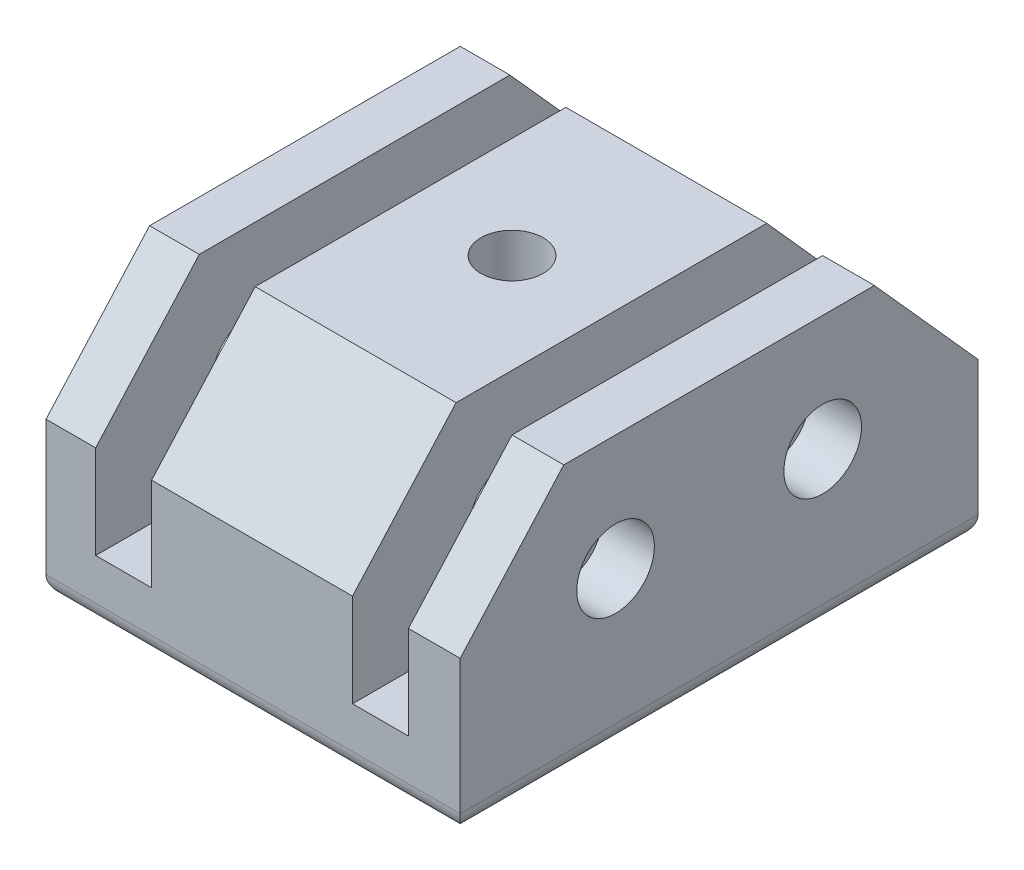
ISO-10303-21;
HEADER;
FILE_DESCRIPTION(('STEP AP214'),'2;1');
FILE_NAME('part.step','',(''),(''),'','','');
FILE_SCHEMA(('AUTOMOTIVE_DESIGN { 1 0 10303 214 1 1 1 1 }'));
ENDSEC;
DATA;
#1=APPLICATION_CONTEXT('core data for automotive mechanical design processes');
#2=APPLICATION_PROTOCOL_DEFINITION('international standard','automotive_design',2000,#1);
#3=PRODUCT_CONTEXT('',#1,'mechanical');
#4=PRODUCT('Part','Part','',(#3));
#5=PRODUCT_RELATED_PRODUCT_CATEGORY('part','',(#4));
#6=PRODUCT_DEFINITION_FORMATION('','',#4);
#7=PRODUCT_DEFINITION_CONTEXT('part definition',#1,'design');
#8=PRODUCT_DEFINITION('design','',#6,#7);
#9=PRODUCT_DEFINITION_SHAPE('','',#8);
#10=(LENGTH_UNIT() NAMED_UNIT(*) SI_UNIT(.MILLI.,.METRE.));
#11=(NAMED_UNIT(*) PLANE_ANGLE_UNIT() SI_UNIT($,.RADIAN.));
#12=(NAMED_UNIT(*) SI_UNIT($,.STERADIAN.) SOLID_ANGLE_UNIT());
#13=UNCERTAINTY_MEASURE_WITH_UNIT(LENGTH_MEASURE(1.E-05),#10,'distance_accuracy_value','');
#14=(GEOMETRIC_REPRESENTATION_CONTEXT(3) GLOBAL_UNCERTAINTY_ASSIGNED_CONTEXT((#13)) GLOBAL_UNIT_ASSIGNED_CONTEXT((#10,
#11,#12)) REPRESENTATION_CONTEXT('',''));
#15=CARTESIAN_POINT('',(0.,0.,0.));
#16=DIRECTION('',(0.,0.,1.));
#17=DIRECTION('',(1.,0.,0.));
#18=AXIS2_PLACEMENT_3D('',#15,#16,#17);
#19=CARTESIAN_POINT('',(-25.4,33.2490316571237,-31.75));
#20=DIRECTION('',(0.,-1.,0.));
#21=DIRECTION('',(0.,0.,-1.));
#22=AXIS2_PLACEMENT_3D('',#19,#20,#21);
#23=CYLINDRICAL_SURFACE('',#22,3.81);
#24=CARTESIAN_POINT('',(-25.4,33.2490316571237,-31.75));
#25=DIRECTION('',(0.,-1.,0.));
#26=DIRECTION('',(0.,0.,-1.));
#27=AXIS2_PLACEMENT_3D('',#24,#25,#26);
#28=CIRCLE('',#27,3.81);
#29=CARTESIAN_POINT('',(-25.4,33.2490316571237,-35.56));
#30=VERTEX_POINT('',#29);
#31=EDGE_CURVE('E293',#30,#30,#28,.T.);
#32=ORIENTED_EDGE('',*,*,#31,.F.);
#33=EDGE_LOOP('',(#32));
#34=FACE_BOUND('',#33,.T.);
#35=CARTESIAN_POINT('',(-25.4,6.35,-31.75));
#36=DIRECTION('',(0.,-1.,0.));
#37=DIRECTION('',(0.,0.,-1.));
#38=AXIS2_PLACEMENT_3D('',#35,#36,#37);
#39=CIRCLE('',#38,3.81);
#40=CARTESIAN_POINT('',(-25.4,6.35,-35.56));
#41=VERTEX_POINT('',#40);
#42=EDGE_CURVE('E49',#41,#41,#39,.F.);
#43=ORIENTED_EDGE('',*,*,#42,.F.);
#44=EDGE_LOOP('',(#43));
#45=FACE_BOUND('',#44,.T.);
#46=ADVANCED_FACE('F45',(#34,#45),#23,.F.);
#47=CARTESIAN_POINT('',(-50.8,19.05,0.));
#48=DIRECTION('',(0.,0.666666666666667,0.74535599249993));
#49=DIRECTION('',(0.,-0.74535599249993,0.666666666666667));
#50=AXIS2_PLACEMENT_3D('',#47,#48,#49);
#51=PLANE('',#50);
#52=DIRECTION('',(0.,-0.74535599249993,0.666666666666667));
#53=VECTOR('',#52,1.);
#54=CARTESIAN_POINT('',(-44.704,19.05,0.));
#55=LINE('',#54,#53);
#56=CARTESIAN_POINT('',(-44.704,33.2490316571237,-12.7));
#57=VERTEX_POINT('',#56);
#58=CARTESIAN_POINT('',(-44.704,19.05,0.));
#59=VERTEX_POINT('',#58);
#60=EDGE_CURVE('E383',#57,#59,#55,.T.);
#61=ORIENTED_EDGE('',*,*,#60,.F.);
#62=DIRECTION('',(1.,0.,0.));
#63=VECTOR('',#62,1.);
#64=CARTESIAN_POINT('',(-50.8,33.2490316571237,-12.7));
#65=LINE('',#64,#63);
#66=CARTESIAN_POINT('',(-50.8,33.2490316571237,-12.7));
#67=VERTEX_POINT('',#66);
#68=EDGE_CURVE('E462',#67,#57,#65,.T.);
#69=ORIENTED_EDGE('',*,*,#68,.F.);
#70=DIRECTION('',(0.,-0.74535599249993,0.666666666666667));
#71=VECTOR('',#70,1.);
#72=CARTESIAN_POINT('',(-50.8,19.05,0.));
#73=LINE('',#72,#71);
#74=CARTESIAN_POINT('',(-50.8,19.05,0.));
#75=VERTEX_POINT('',#74);
#76=EDGE_CURVE('E440',#67,#75,#73,.T.);
#77=ORIENTED_EDGE('',*,*,#76,.T.);
#78=DIRECTION('',(1.,0.,0.));
#79=VECTOR('',#78,1.);
#80=CARTESIAN_POINT('',(-50.8,19.05,0.));
#81=LINE('',#80,#79);
#82=EDGE_CURVE('E455',#75,#59,#81,.T.);
#83=ORIENTED_EDGE('',*,*,#82,.T.);
#84=EDGE_LOOP('',(#61,#69,#77,#83));
#85=FACE_BOUND('',#84,.T.);
#86=ADVANCED_FACE('F605',(#85),#51,.T.);
#87=CARTESIAN_POINT('',(-50.8,33.2490316571237,-12.7));
#88=DIRECTION('',(0.,1.,0.));
#89=DIRECTION('',(0.,0.,1.));
#90=AXIS2_PLACEMENT_3D('',#87,#88,#89);
#91=PLANE('',#90);
#92=DIRECTION('',(0.,0.,-1.));
#93=VECTOR('',#92,1.);
#94=CARTESIAN_POINT('',(-44.704,33.2490316571237,0.));
#95=LINE('',#94,#93);
#96=CARTESIAN_POINT('',(-44.704,33.2490316571237,-50.8));
#97=VERTEX_POINT('',#96);
#98=EDGE_CURVE('E355',#57,#97,#95,.T.);
#99=ORIENTED_EDGE('',*,*,#98,.T.);
#100=DIRECTION('',(1.,0.,0.));
#101=VECTOR('',#100,1.);
#102=CARTESIAN_POINT('',(-50.8,33.2490316571237,-50.8));
#103=LINE('',#102,#101);
#104=CARTESIAN_POINT('',(-50.8,33.2490316571237,-50.8));
#105=VERTEX_POINT('',#104);
#106=EDGE_CURVE('E468',#105,#97,#103,.T.);
#107=ORIENTED_EDGE('',*,*,#106,.F.);
#108=DIRECTION('',(0.,0.,1.));
#109=VECTOR('',#108,1.);
#110=CARTESIAN_POINT('',(-50.8,33.2490316571237,-12.7));
#111=LINE('',#110,#109);
#112=EDGE_CURVE('E435',#105,#67,#111,.T.);
#113=ORIENTED_EDGE('',*,*,#112,.T.);
#114=ORIENTED_EDGE('',*,*,#68,.T.);
#115=EDGE_LOOP('',(#99,#107,#113,#114));
#116=FACE_BOUND('',#115,.T.);
#117=ADVANCED_FACE('F603',(#116),#91,.T.);
#118=CARTESIAN_POINT('',(-50.8,33.2490316571237,-50.8));
#119=DIRECTION('',(0.,0.666666666666666,-0.74535599249993));
#120=DIRECTION('',(0.,0.74535599249993,0.666666666666666));
#121=AXIS2_PLACEMENT_3D('',#118,#119,#120);
#122=PLANE('',#121);
#123=DIRECTION('',(0.,0.74535599249993,0.666666666666666));
#124=VECTOR('',#123,1.);
#125=CARTESIAN_POINT('',(-44.704,33.2490316571237,-50.8));
#126=LINE('',#125,#124);
#127=CARTESIAN_POINT('',(-44.704,19.05,-63.5));
#128=VERTEX_POINT('',#127);
#129=EDGE_CURVE('E380',#128,#97,#126,.T.);
#130=ORIENTED_EDGE('',*,*,#129,.F.);
#131=DIRECTION('',(1.,0.,0.));
#132=VECTOR('',#131,1.);
#133=CARTESIAN_POINT('',(-50.8,19.05,-63.5));
#134=LINE('',#133,#132);
#135=CARTESIAN_POINT('',(-50.8,19.05,-63.5));
#136=VERTEX_POINT('',#135);
#137=EDGE_CURVE('E474',#136,#128,#134,.T.);
#138=ORIENTED_EDGE('',*,*,#137,.F.);
#139=DIRECTION('',(0.,0.74535599249993,0.666666666666666));
#140=VECTOR('',#139,1.);
#141=CARTESIAN_POINT('',(-50.8,33.2490316571237,-50.8));
#142=LINE('',#141,#140);
#143=EDGE_CURVE('E431',#136,#105,#142,.T.);
#144=ORIENTED_EDGE('',*,*,#143,.T.);
#145=ORIENTED_EDGE('',*,*,#106,.T.);
#146=EDGE_LOOP('',(#130,#138,#144,#145));
#147=FACE_BOUND('',#146,.T.);
#148=ADVANCED_FACE('F598',(#147),#122,.T.);
#149=DIRECTION('',(0.,0.74535599249993,-0.666666666666667));
#150=VECTOR('',#149,1.);
#151=CARTESIAN_POINT('',(-37.846,19.05,0.));
#152=LINE('',#151,#150);
#153=CARTESIAN_POINT('',(-37.846,19.05,0.));
#154=VERTEX_POINT('',#153);
#155=CARTESIAN_POINT('',(-37.846,33.2490316571237,-12.7));
#156=VERTEX_POINT('',#155);
#157=EDGE_CURVE('E377',#154,#156,#152,.T.);
#158=ORIENTED_EDGE('',*,*,#157,.F.);
#159=CARTESIAN_POINT('',(-13.208,19.05,0.));
#160=VERTEX_POINT('',#159);
#161=EDGE_CURVE('E460',#154,#160,#81,.T.);
#162=ORIENTED_EDGE('',*,*,#161,.T.);
#163=DIRECTION('',(0.,-0.74535599249993,0.666666666666667));
#164=VECTOR('',#163,1.);
#165=CARTESIAN_POINT('',(-13.208,19.05,0.));
#166=LINE('',#165,#164);
#167=CARTESIAN_POINT('',(-13.208,33.2490316571237,-12.7));
#168=VERTEX_POINT('',#167);
#169=EDGE_CURVE('E426',#168,#160,#166,.T.);
#170=ORIENTED_EDGE('',*,*,#169,.F.);
#171=EDGE_CURVE('E466',#156,#168,#65,.T.);
#172=ORIENTED_EDGE('',*,*,#171,.F.);
#173=EDGE_LOOP('',(#158,#162,#170,#172));
#174=FACE_BOUND('',#173,.T.);
#175=ADVANCED_FACE('F629',(#174),#51,.T.);
#176=ORIENTED_EDGE('',*,*,#31,.T.);
#177=EDGE_LOOP('',(#176));
#178=FACE_BOUND('',#177,.T.);
#179=DIRECTION('',(0.,0.,-1.));
#180=VECTOR('',#179,1.);
#181=CARTESIAN_POINT('',(-37.846,33.2490316571237,0.));
#182=LINE('',#181,#180);
#183=CARTESIAN_POINT('',(-37.846,33.2490316571237,-50.8));
#184=VERTEX_POINT('',#183);
#185=EDGE_CURVE('E369',#156,#184,#182,.T.);
#186=ORIENTED_EDGE('',*,*,#185,.F.);
#187=ORIENTED_EDGE('',*,*,#171,.T.);
#188=DIRECTION('',(0.,0.,-1.));
#189=VECTOR('',#188,1.);
#190=CARTESIAN_POINT('',(-13.208,33.2490316571237,0.));
#191=LINE('',#190,#189);
#192=CARTESIAN_POINT('',(-13.208,33.2490316571237,-50.8));
#193=VERTEX_POINT('',#192);
#194=EDGE_CURVE('E400',#168,#193,#191,.T.);
#195=ORIENTED_EDGE('',*,*,#194,.T.);
#196=EDGE_CURVE('E472',#184,#193,#103,.T.);
#197=ORIENTED_EDGE('',*,*,#196,.F.);
#198=EDGE_LOOP('',(#186,#187,#195,#197));
#199=FACE_BOUND('',#198,.T.);
#200=ADVANCED_FACE('F640',(#178,#199),#91,.T.);
#201=DIRECTION('',(0.,-0.74535599249993,-0.666666666666666));
#202=VECTOR('',#201,1.);
#203=CARTESIAN_POINT('',(-37.846,33.2490316571237,-50.8));
#204=LINE('',#203,#202);
#205=CARTESIAN_POINT('',(-37.846,19.05,-63.5));
#206=VERTEX_POINT('',#205);
#207=EDGE_CURVE('E364',#184,#206,#204,.T.);
#208=ORIENTED_EDGE('',*,*,#207,.F.);
#209=ORIENTED_EDGE('',*,*,#196,.T.);
#210=DIRECTION('',(0.,0.74535599249993,0.666666666666666));
#211=VECTOR('',#210,1.);
#212=CARTESIAN_POINT('',(-13.208,33.2490316571237,-50.8));
#213=LINE('',#212,#211);
#214=CARTESIAN_POINT('',(-13.208,19.05,-63.5));
#215=VERTEX_POINT('',#214);
#216=EDGE_CURVE('E495',#215,#193,#213,.T.);
#217=ORIENTED_EDGE('',*,*,#216,.F.);
#218=EDGE_CURVE('E478',#206,#215,#134,.T.);
#219=ORIENTED_EDGE('',*,*,#218,.F.);
#220=EDGE_LOOP('',(#208,#209,#217,#219));
#221=FACE_BOUND('',#220,.T.);
#222=ADVANCED_FACE('F619',(#221),#122,.T.);
#223=CARTESIAN_POINT('',(-50.8,0.,0.));
#224=DIRECTION('',(0.,0.,1.));
#225=DIRECTION('',(1.,0.,0.));
#226=AXIS2_PLACEMENT_3D('',#223,#224,#225);
#227=PLANE('',#226);
#228=DIRECTION('',(0.,-1.,0.));
#229=VECTOR('',#228,1.);
#230=CARTESIAN_POINT('',(-50.8,0.,0.));
#231=LINE('',#230,#229);
#232=CARTESIAN_POINT('',(-50.8,2.54,0.));
#233=VERTEX_POINT('',#232);
#234=EDGE_CURVE('E479',#75,#233,#231,.T.);
#235=ORIENTED_EDGE('',*,*,#234,.T.);
#236=DIRECTION('',(1.,0.,0.));
#237=VECTOR('',#236,1.);
#238=CARTESIAN_POINT('',(-50.8,2.54,0.));
#239=LINE('',#238,#237);
#240=CARTESIAN_POINT('',(0.,2.54,0.));
#241=VERTEX_POINT('',#240);
#242=EDGE_CURVE('E55',#233,#241,#239,.T.);
#243=ORIENTED_EDGE('',*,*,#242,.T.);
#244=DIRECTION('',(0.,-1.,0.));
#245=VECTOR('',#244,1.);
#246=CARTESIAN_POINT('',(0.,0.,0.));
#247=LINE('',#246,#245);
#248=CARTESIAN_POINT('',(0.,19.05,0.));
#249=VERTEX_POINT('',#248);
#250=EDGE_CURVE('E459',#249,#241,#247,.T.);
#251=ORIENTED_EDGE('',*,*,#250,.F.);
#252=CARTESIAN_POINT('',(-6.35,19.05,0.));
#253=VERTEX_POINT('',#252);
#254=EDGE_CURVE('E461',#253,#249,#81,.T.);
#255=ORIENTED_EDGE('',*,*,#254,.F.);
#256=DIRECTION('',(0.,-1.,0.));
#257=VECTOR('',#256,1.);
#258=CARTESIAN_POINT('',(-6.35,7.62,0.));
#259=LINE('',#258,#257);
#260=CARTESIAN_POINT('',(-6.35,7.62,0.));
#261=VERTEX_POINT('',#260);
#262=EDGE_CURVE('E391',#253,#261,#259,.T.);
#263=ORIENTED_EDGE('',*,*,#262,.T.);
#264=DIRECTION('',(-1.,0.,0.));
#265=VECTOR('',#264,1.);
#266=CARTESIAN_POINT('',(-6.35,7.62,0.));
#267=LINE('',#266,#265);
#268=CARTESIAN_POINT('',(-13.208,7.62,0.));
#269=VERTEX_POINT('',#268);
#270=EDGE_CURVE('E396',#261,#269,#267,.T.);
#271=ORIENTED_EDGE('',*,*,#270,.T.);
#272=DIRECTION('',(0.,1.,0.));
#273=VECTOR('',#272,1.);
#274=CARTESIAN_POINT('',(-13.208,7.62,0.));
#275=LINE('',#274,#273);
#276=EDGE_CURVE('E387',#269,#160,#275,.T.);
#277=ORIENTED_EDGE('',*,*,#276,.T.);
#278=ORIENTED_EDGE('',*,*,#161,.F.);
#279=DIRECTION('',(0.,-1.,0.));
#280=VECTOR('',#279,1.);
#281=CARTESIAN_POINT('',(-37.846,7.62,0.));
#282=LINE('',#281,#280);
#283=CARTESIAN_POINT('',(-37.846,7.62,0.));
#284=VERTEX_POINT('',#283);
#285=EDGE_CURVE('E346',#154,#284,#282,.T.);
#286=ORIENTED_EDGE('',*,*,#285,.T.);
#287=DIRECTION('',(-1.,0.,0.));
#288=VECTOR('',#287,1.);
#289=CARTESIAN_POINT('',(-37.846,7.62,0.));
#290=LINE('',#289,#288);
#291=CARTESIAN_POINT('',(-44.704,7.62,0.));
#292=VERTEX_POINT('',#291);
#293=EDGE_CURVE('E351',#284,#292,#290,.T.);
#294=ORIENTED_EDGE('',*,*,#293,.T.);
#295=DIRECTION('',(0.,1.,0.));
#296=VECTOR('',#295,1.);
#297=CARTESIAN_POINT('',(-44.704,7.62,0.));
#298=LINE('',#297,#296);
#299=EDGE_CURVE('E342',#292,#59,#298,.T.);
#300=ORIENTED_EDGE('',*,*,#299,.T.);
#301=ORIENTED_EDGE('',*,*,#82,.F.);
#302=EDGE_LOOP('',(#235,#243,#251,#255,#263,#271,#277,#278,#286,#294,#300,#301));
#303=FACE_BOUND('',#302,.T.);
#304=ADVANCED_FACE('F587',(#303),#227,.T.);
#305=CARTESIAN_POINT('',(-50.8,0.,-63.5));
#306=DIRECTION('',(0.,0.,-1.));
#307=DIRECTION('',(-1.,0.,0.));
#308=AXIS2_PLACEMENT_3D('',#305,#306,#307);
#309=PLANE('',#308);
#310=DIRECTION('',(0.,1.,0.));
#311=VECTOR('',#310,1.);
#312=CARTESIAN_POINT('',(0.,0.,-63.5));
#313=LINE('',#312,#311);
#314=CARTESIAN_POINT('',(0.,2.54,-63.5));
#315=VERTEX_POINT('',#314);
#316=CARTESIAN_POINT('',(0.,19.05,-63.5));
#317=VERTEX_POINT('',#316);
#318=EDGE_CURVE('E484',#315,#317,#313,.T.);
#319=ORIENTED_EDGE('',*,*,#318,.F.);
#320=DIRECTION('',(1.,0.,0.));
#321=VECTOR('',#320,1.);
#322=CARTESIAN_POINT('',(-50.8,2.54,-63.5));
#323=LINE('',#322,#321);
#324=CARTESIAN_POINT('',(-50.8,2.54,-63.5));
#325=VERTEX_POINT('',#324);
#326=EDGE_CURVE('E12',#315,#325,#323,.F.);
#327=ORIENTED_EDGE('',*,*,#326,.T.);
#328=DIRECTION('',(0.,1.,0.));
#329=VECTOR('',#328,1.);
#330=CARTESIAN_POINT('',(-50.8,0.,-63.5));
#331=LINE('',#330,#329);
#332=EDGE_CURVE('E483',#325,#136,#331,.T.);
#333=ORIENTED_EDGE('',*,*,#332,.T.);
#334=ORIENTED_EDGE('',*,*,#137,.T.);
#335=DIRECTION('',(0.,1.,0.));
#336=VECTOR('',#335,1.);
#337=CARTESIAN_POINT('',(-44.704,7.62,-63.5));
#338=LINE('',#337,#336);
#339=CARTESIAN_POINT('',(-44.704,7.62,-63.5));
#340=VERTEX_POINT('',#339);
#341=EDGE_CURVE('E341',#340,#128,#338,.T.);
#342=ORIENTED_EDGE('',*,*,#341,.F.);
#343=DIRECTION('',(-1.,0.,0.));
#344=VECTOR('',#343,1.);
#345=CARTESIAN_POINT('',(-37.846,7.62,-63.5));
#346=LINE('',#345,#344);
#347=CARTESIAN_POINT('',(-37.846,7.62,-63.5));
#348=VERTEX_POINT('',#347);
#349=EDGE_CURVE('E347',#348,#340,#346,.T.);
#350=ORIENTED_EDGE('',*,*,#349,.F.);
#351=DIRECTION('',(0.,-1.,0.));
#352=VECTOR('',#351,1.);
#353=CARTESIAN_POINT('',(-37.846,0.,-63.5));
#354=LINE('',#353,#352);
#355=EDGE_CURVE('E499',#206,#348,#354,.T.);
#356=ORIENTED_EDGE('',*,*,#355,.F.);
#357=ORIENTED_EDGE('',*,*,#218,.T.);
#358=DIRECTION('',(0.,1.,0.));
#359=VECTOR('',#358,1.);
#360=CARTESIAN_POINT('',(-13.208,7.62,-63.5));
#361=LINE('',#360,#359);
#362=CARTESIAN_POINT('',(-13.208,7.62,-63.5));
#363=VERTEX_POINT('',#362);
#364=EDGE_CURVE('E386',#363,#215,#361,.T.);
#365=ORIENTED_EDGE('',*,*,#364,.F.);
#366=DIRECTION('',(-1.,0.,0.));
#367=VECTOR('',#366,1.);
#368=CARTESIAN_POINT('',(-6.35,7.62,-63.5));
#369=LINE('',#368,#367);
#370=CARTESIAN_POINT('',(-6.35,7.62,-63.5));
#371=VERTEX_POINT('',#370);
#372=EDGE_CURVE('E392',#371,#363,#369,.T.);
#373=ORIENTED_EDGE('',*,*,#372,.F.);
#374=DIRECTION('',(0.,-1.,0.));
#375=VECTOR('',#374,1.);
#376=CARTESIAN_POINT('',(-6.35,7.62,-63.5));
#377=LINE('',#376,#375);
#378=CARTESIAN_POINT('',(-6.35,19.05,-63.5));
#379=VERTEX_POINT('',#378);
#380=EDGE_CURVE('E404',#379,#371,#377,.T.);
#381=ORIENTED_EDGE('',*,*,#380,.F.);
#382=EDGE_CURVE('E444',#379,#317,#134,.T.);
#383=ORIENTED_EDGE('',*,*,#382,.T.);
#384=EDGE_LOOP('',(#319,#327,#333,#334,#342,#350,#356,#357,#365,#373,#381,#383));
#385=FACE_BOUND('',#384,.T.);
#386=ADVANCED_FACE('F564',(#385),#309,.T.);
#387=CARTESIAN_POINT('',(-50.8,0.,0.));
#388=DIRECTION('',(0.,-1.,0.));
#389=DIRECTION('',(0.,0.,-1.));
#390=AXIS2_PLACEMENT_3D('',#387,#388,#389);
#391=PLANE('',#390);
#392=DIRECTION('',(-1.,0.,0.));
#393=VECTOR('',#392,1.);
#394=CARTESIAN_POINT('',(-21.4405318538975,0.,-24.892));
#395=LINE('',#394,#393);
#396=CARTESIAN_POINT('',(-21.4405318538975,0.,-24.892));
#397=VERTEX_POINT('',#396);
#398=CARTESIAN_POINT('',(-29.3594681461025,0.,-24.892));
#399=VERTEX_POINT('',#398);
#400=EDGE_CURVE('E63',#397,#399,#395,.T.);
#401=ORIENTED_EDGE('',*,*,#400,.F.);
#402=DIRECTION('',(-0.5,0.,0.866025403784439));
#403=VECTOR('',#402,1.);
#404=CARTESIAN_POINT('',(-17.4810637077951,0.,-31.75));
#405=LINE('',#404,#403);
#406=CARTESIAN_POINT('',(-17.4810637077951,0.,-31.75));
#407=VERTEX_POINT('',#406);
#408=EDGE_CURVE('E245',#407,#397,#405,.T.);
#409=ORIENTED_EDGE('',*,*,#408,.F.);
#410=DIRECTION('',(0.5,0.,0.866025403784438));
#411=VECTOR('',#410,1.);
#412=CARTESIAN_POINT('',(-21.4405318538975,0.,-38.608));
#413=LINE('',#412,#411);
#414=CARTESIAN_POINT('',(-21.4405318538975,0.,-38.608));
#415=VERTEX_POINT('',#414);
#416=EDGE_CURVE('E249',#415,#407,#413,.T.);
#417=ORIENTED_EDGE('',*,*,#416,.F.);
#418=DIRECTION('',(1.,0.,0.));
#419=VECTOR('',#418,1.);
#420=CARTESIAN_POINT('',(-29.3594681461025,0.,-38.608));
#421=LINE('',#420,#419);
#422=CARTESIAN_POINT('',(-29.3594681461025,0.,-38.608));
#423=VERTEX_POINT('',#422);
#424=EDGE_CURVE('E272',#423,#415,#421,.T.);
#425=ORIENTED_EDGE('',*,*,#424,.F.);
#426=DIRECTION('',(0.5,0.,-0.866025403784439));
#427=VECTOR('',#426,1.);
#428=CARTESIAN_POINT('',(-33.3189362922049,0.,-31.75));
#429=LINE('',#428,#427);
#430=CARTESIAN_POINT('',(-33.3189362922049,0.,-31.75));
#431=VERTEX_POINT('',#430);
#432=EDGE_CURVE('E268',#431,#423,#429,.T.);
#433=ORIENTED_EDGE('',*,*,#432,.F.);
#434=DIRECTION('',(-0.5,0.,-0.866025403784439));
#435=VECTOR('',#434,1.);
#436=CARTESIAN_POINT('',(-29.3594681461025,0.,-24.892));
#437=LINE('',#436,#435);
#438=EDGE_CURVE('E265',#399,#431,#437,.T.);
#439=ORIENTED_EDGE('',*,*,#438,.F.);
#440=EDGE_LOOP('',(#401,#409,#417,#425,#433,#439));
#441=FACE_BOUND('',#440,.T.);
#442=DIRECTION('',(0.,0.,-1.));
#443=VECTOR('',#442,1.);
#444=CARTESIAN_POINT('',(-2.54,0.,0.));
#445=LINE('',#444,#443);
#446=CARTESIAN_POINT('',(-2.54,0.,-60.96));
#447=VERTEX_POINT('',#446);
#448=CARTESIAN_POINT('',(-2.54,0.,-2.54));
#449=VERTEX_POINT('',#448);
#450=EDGE_CURVE('E518',#447,#449,#445,.F.);
#451=ORIENTED_EDGE('',*,*,#450,.T.);
#452=DIRECTION('',(1.,0.,0.));
#453=VECTOR('',#452,1.);
#454=CARTESIAN_POINT('',(-50.8,0.,-2.54));
#455=LINE('',#454,#453);
#456=CARTESIAN_POINT('',(-48.26,0.,-2.54));
#457=VERTEX_POINT('',#456);
#458=EDGE_CURVE('E522',#449,#457,#455,.F.);
#459=ORIENTED_EDGE('',*,*,#458,.T.);
#460=DIRECTION('',(0.,0.,-1.));
#461=VECTOR('',#460,1.);
#462=CARTESIAN_POINT('',(-48.26,0.,0.));
#463=LINE('',#462,#461);
#464=CARTESIAN_POINT('',(-48.26,0.,-60.96));
#465=VERTEX_POINT('',#464);
#466=EDGE_CURVE('E515',#457,#465,#463,.T.);
#467=ORIENTED_EDGE('',*,*,#466,.T.);
#468=DIRECTION('',(1.,0.,0.));
#469=VECTOR('',#468,1.);
#470=CARTESIAN_POINT('',(-50.8,0.,-60.96));
#471=LINE('',#470,#469);
#472=EDGE_CURVE('E512',#465,#447,#471,.T.);
#473=ORIENTED_EDGE('',*,*,#472,.T.);
#474=EDGE_LOOP('',(#451,#459,#467,#473));
#475=FACE_BOUND('',#474,.T.);
#476=ADVANCED_FACE('F552',(#441,#475),#391,.T.);
#477=CARTESIAN_POINT('',(-50.8,0.,0.));
#478=DIRECTION('',(-1.,0.,0.));
#479=DIRECTION('',(0.,0.,1.));
#480=AXIS2_PLACEMENT_3D('',#477,#478,#479);
#481=PLANE('',#480);
#482=CARTESIAN_POINT('',(-50.8,19.05,-19.05));
#483=DIRECTION('',(1.,0.,0.));
#484=DIRECTION('',(0.,0.,-1.));
#485=AXIS2_PLACEMENT_3D('',#482,#483,#484);
#486=CIRCLE('',#485,4.7625);
#487=CARTESIAN_POINT('',(-50.8,19.05,-23.8125));
#488=VERTEX_POINT('',#487);
#489=EDGE_CURVE('E298',#488,#488,#486,.T.);
#490=ORIENTED_EDGE('',*,*,#489,.T.);
#491=EDGE_LOOP('',(#490));
#492=FACE_BOUND('',#491,.T.);
#493=CARTESIAN_POINT('',(-50.8,19.05,-44.45));
#494=DIRECTION('',(1.,0.,0.));
#495=DIRECTION('',(0.,0.,-1.));
#496=AXIS2_PLACEMENT_3D('',#493,#494,#495);
#497=CIRCLE('',#496,4.7625);
#498=CARTESIAN_POINT('',(-50.8,19.05,-49.2125));
#499=VERTEX_POINT('',#498);
#500=EDGE_CURVE('E307',#499,#499,#497,.T.);
#501=ORIENTED_EDGE('',*,*,#500,.T.);
#502=EDGE_LOOP('',(#501));
#503=FACE_BOUND('',#502,.T.);
#504=ORIENTED_EDGE('',*,*,#332,.F.);
#505=DIRECTION('',(0.,0.,-1.));
#506=VECTOR('',#505,1.);
#507=CARTESIAN_POINT('',(-50.8,2.54,0.));
#508=LINE('',#507,#506);
#509=EDGE_CURVE('E525',#325,#233,#508,.F.);
#510=ORIENTED_EDGE('',*,*,#509,.T.);
#511=ORIENTED_EDGE('',*,*,#234,.F.);
#512=ORIENTED_EDGE('',*,*,#76,.F.);
#513=ORIENTED_EDGE('',*,*,#112,.F.);
#514=ORIENTED_EDGE('',*,*,#143,.F.);
#515=EDGE_LOOP('',(#504,#510,#511,#512,#513,#514));
#516=FACE_BOUND('',#515,.T.);
#517=ADVANCED_FACE('F591',(#492,#503,#516),#481,.T.);
#518=CARTESIAN_POINT('',(0.,0.,0.));
#519=DIRECTION('',(-1.,0.,0.));
#520=DIRECTION('',(0.,0.,1.));
#521=AXIS2_PLACEMENT_3D('',#518,#519,#520);
#522=PLANE('',#521);
#523=CARTESIAN_POINT('',(0.,19.05,-19.05));
#524=DIRECTION('',(1.,0.,0.));
#525=DIRECTION('',(0.,0.,-1.));
#526=AXIS2_PLACEMENT_3D('',#523,#524,#525);
#527=CIRCLE('',#526,4.7625);
#528=CARTESIAN_POINT('',(0.,19.05,-23.8125));
#529=VERTEX_POINT('',#528);
#530=EDGE_CURVE('E303',#529,#529,#527,.T.);
#531=ORIENTED_EDGE('',*,*,#530,.F.);
#532=EDGE_LOOP('',(#531));
#533=FACE_BOUND('',#532,.T.);
#534=CARTESIAN_POINT('',(0.,19.05,-44.45));
#535=DIRECTION('',(1.,0.,0.));
#536=DIRECTION('',(0.,0.,-1.));
#537=AXIS2_PLACEMENT_3D('',#534,#535,#536);
#538=CIRCLE('',#537,4.7625);
#539=CARTESIAN_POINT('',(0.,19.05,-49.2125));
#540=VERTEX_POINT('',#539);
#541=EDGE_CURVE('E311',#540,#540,#538,.T.);
#542=ORIENTED_EDGE('',*,*,#541,.F.);
#543=EDGE_LOOP('',(#542));
#544=FACE_BOUND('',#543,.T.);
#545=ORIENTED_EDGE('',*,*,#250,.T.);
#546=DIRECTION('',(0.,0.,-1.));
#547=VECTOR('',#546,1.);
#548=CARTESIAN_POINT('',(0.,2.54,-63.5));
#549=LINE('',#548,#547);
#550=EDGE_CURVE('E502',#241,#315,#549,.T.);
#551=ORIENTED_EDGE('',*,*,#550,.T.);
#552=ORIENTED_EDGE('',*,*,#318,.T.);
#553=DIRECTION('',(0.,0.74535599249993,0.666666666666666));
#554=VECTOR('',#553,1.);
#555=CARTESIAN_POINT('',(0.,33.2490316571237,-50.8));
#556=LINE('',#555,#554);
#557=CARTESIAN_POINT('',(0.,33.2490316571237,-50.8));
#558=VERTEX_POINT('',#557);
#559=EDGE_CURVE('E430',#317,#558,#556,.T.);
#560=ORIENTED_EDGE('',*,*,#559,.T.);
#561=DIRECTION('',(0.,0.,1.));
#562=VECTOR('',#561,1.);
#563=CARTESIAN_POINT('',(0.,33.2490316571237,-12.7));
#564=LINE('',#563,#562);
#565=CARTESIAN_POINT('',(0.,33.2490316571237,-12.7));
#566=VERTEX_POINT('',#565);
#567=EDGE_CURVE('E448',#558,#566,#564,.T.);
#568=ORIENTED_EDGE('',*,*,#567,.T.);
#569=DIRECTION('',(0.,-0.74535599249993,0.666666666666667));
#570=VECTOR('',#569,1.);
#571=CARTESIAN_POINT('',(0.,19.05,0.));
#572=LINE('',#571,#570);
#573=EDGE_CURVE('E436',#566,#249,#572,.T.);
#574=ORIENTED_EDGE('',*,*,#573,.T.);
#575=EDGE_LOOP('',(#545,#551,#552,#560,#568,#574));
#576=FACE_BOUND('',#575,.T.);
#577=ADVANCED_FACE('F561',(#533,#544,#576),#522,.F.);
#578=DIRECTION('',(0.,0.74535599249993,-0.666666666666667));
#579=VECTOR('',#578,1.);
#580=CARTESIAN_POINT('',(-6.35,19.05,0.));
#581=LINE('',#580,#579);
#582=CARTESIAN_POINT('',(-6.35,33.2490316571237,-12.7));
#583=VERTEX_POINT('',#582);
#584=EDGE_CURVE('E413',#253,#583,#581,.T.);
#585=ORIENTED_EDGE('',*,*,#584,.F.);
#586=ORIENTED_EDGE('',*,*,#254,.T.);
#587=ORIENTED_EDGE('',*,*,#573,.F.);
#588=EDGE_CURVE('E467',#583,#566,#65,.T.);
#589=ORIENTED_EDGE('',*,*,#588,.F.);
#590=EDGE_LOOP('',(#585,#586,#587,#589));
#591=FACE_BOUND('',#590,.T.);
#592=ADVANCED_FACE('F583',(#591),#51,.T.);
#593=DIRECTION('',(0.,0.,-1.));
#594=VECTOR('',#593,1.);
#595=CARTESIAN_POINT('',(-6.35,33.2490316571237,0.));
#596=LINE('',#595,#594);
#597=CARTESIAN_POINT('',(-6.35,33.2490316571237,-50.8));
#598=VERTEX_POINT('',#597);
#599=EDGE_CURVE('E418',#583,#598,#596,.T.);
#600=ORIENTED_EDGE('',*,*,#599,.F.);
#601=ORIENTED_EDGE('',*,*,#588,.T.);
#602=ORIENTED_EDGE('',*,*,#567,.F.);
#603=EDGE_CURVE('E473',#598,#558,#103,.T.);
#604=ORIENTED_EDGE('',*,*,#603,.F.);
#605=EDGE_LOOP('',(#600,#601,#602,#604));
#606=FACE_BOUND('',#605,.T.);
#607=ADVANCED_FACE('F578',(#606),#91,.T.);
#608=DIRECTION('',(0.,-0.74535599249993,-0.666666666666666));
#609=VECTOR('',#608,1.);
#610=CARTESIAN_POINT('',(-6.35,33.2490316571237,-50.8));
#611=LINE('',#610,#609);
#612=EDGE_CURVE('E487',#598,#379,#611,.T.);
#613=ORIENTED_EDGE('',*,*,#612,.F.);
#614=ORIENTED_EDGE('',*,*,#603,.T.);
#615=ORIENTED_EDGE('',*,*,#559,.F.);
#616=ORIENTED_EDGE('',*,*,#382,.F.);
#617=EDGE_LOOP('',(#613,#614,#615,#616));
#618=FACE_BOUND('',#617,.T.);
#619=ADVANCED_FACE('F572',(#618),#122,.T.);
#620=CARTESIAN_POINT('',(-13.208,7.62,0.));
#621=DIRECTION('',(-1.,0.,0.));
#622=DIRECTION('',(0.,-1.,0.));
#623=AXIS2_PLACEMENT_3D('',#620,#621,#622);
#624=PLANE('',#623);
#625=CARTESIAN_POINT('',(-13.208,19.05,-19.05));
#626=DIRECTION('',(-1.,0.,0.));
#627=DIRECTION('',(0.,-1.,0.));
#628=AXIS2_PLACEMENT_3D('',#625,#626,#627);
#629=CIRCLE('',#628,4.7625);
#630=CARTESIAN_POINT('',(-13.208,14.2875,-19.05));
#631=VERTEX_POINT('',#630);
#632=EDGE_CURVE('E337',#631,#631,#629,.T.);
#633=ORIENTED_EDGE('',*,*,#632,.T.);
#634=EDGE_LOOP('',(#633));
#635=FACE_BOUND('',#634,.T.);
#636=CARTESIAN_POINT('',(-13.208,19.05,-44.45));
#637=DIRECTION('',(-1.,0.,0.));
#638=DIRECTION('',(0.,-1.,0.));
#639=AXIS2_PLACEMENT_3D('',#636,#637,#638);
#640=CIRCLE('',#639,4.7625);
#641=CARTESIAN_POINT('',(-13.208,14.2875,-44.45));
#642=VERTEX_POINT('',#641);
#643=EDGE_CURVE('E324',#642,#642,#640,.T.);
#644=ORIENTED_EDGE('',*,*,#643,.T.);
#645=EDGE_LOOP('',(#644));
#646=FACE_BOUND('',#645,.T.);
#647=ORIENTED_EDGE('',*,*,#169,.T.);
#648=ORIENTED_EDGE('',*,*,#276,.F.);
#649=DIRECTION('',(0.,0.,-1.));
#650=VECTOR('',#649,1.);
#651=CARTESIAN_POINT('',(-13.208,7.62,0.));
#652=LINE('',#651,#650);
#653=EDGE_CURVE('E410',#269,#363,#652,.T.);
#654=ORIENTED_EDGE('',*,*,#653,.T.);
#655=ORIENTED_EDGE('',*,*,#364,.T.);
#656=ORIENTED_EDGE('',*,*,#216,.T.);
#657=ORIENTED_EDGE('',*,*,#194,.F.);
#658=EDGE_LOOP('',(#647,#648,#654,#655,#656,#657));
#659=FACE_BOUND('',#658,.T.);
#660=ADVANCED_FACE('F634',(#635,#646,#659),#624,.F.);
#661=CARTESIAN_POINT('',(-6.35,7.62,0.));
#662=DIRECTION('',(0.,-1.,0.));
#663=DIRECTION('',(0.,0.,-1.));
#664=AXIS2_PLACEMENT_3D('',#661,#662,#663);
#665=PLANE('',#664);
#666=ORIENTED_EDGE('',*,*,#372,.T.);
#667=ORIENTED_EDGE('',*,*,#653,.F.);
#668=ORIENTED_EDGE('',*,*,#270,.F.);
#669=DIRECTION('',(0.,0.,-1.));
#670=VECTOR('',#669,1.);
#671=CARTESIAN_POINT('',(-6.35,7.62,0.));
#672=LINE('',#671,#670);
#673=EDGE_CURVE('E414',#261,#371,#672,.T.);
#674=ORIENTED_EDGE('',*,*,#673,.T.);
#675=EDGE_LOOP('',(#666,#667,#668,#674));
#676=FACE_BOUND('',#675,.T.);
#677=ADVANCED_FACE('F637',(#676),#665,.F.);
#678=CARTESIAN_POINT('',(-6.35,7.62,0.));
#679=DIRECTION('',(1.,0.,0.));
#680=DIRECTION('',(0.,0.,-1.));
#681=AXIS2_PLACEMENT_3D('',#678,#679,#680);
#682=PLANE('',#681);
#683=CARTESIAN_POINT('',(-6.35,19.05,-19.05));
#684=DIRECTION('',(1.,0.,0.));
#685=DIRECTION('',(0.,0.,-1.));
#686=AXIS2_PLACEMENT_3D('',#683,#684,#685);
#687=CIRCLE('',#686,4.7625);
#688=CARTESIAN_POINT('',(-6.35,19.05,-23.8125));
#689=VERTEX_POINT('',#688);
#690=EDGE_CURVE('E333',#689,#689,#687,.T.);
#691=ORIENTED_EDGE('',*,*,#690,.T.);
#692=EDGE_LOOP('',(#691));
#693=FACE_BOUND('',#692,.T.);
#694=CARTESIAN_POINT('',(-6.35,19.05,-44.45));
#695=DIRECTION('',(1.,0.,0.));
#696=DIRECTION('',(0.,0.,-1.));
#697=AXIS2_PLACEMENT_3D('',#694,#695,#696);
#698=CIRCLE('',#697,4.7625);
#699=CARTESIAN_POINT('',(-6.35,19.05,-49.2125));
#700=VERTEX_POINT('',#699);
#701=EDGE_CURVE('E320',#700,#700,#698,.T.);
#702=ORIENTED_EDGE('',*,*,#701,.T.);
#703=EDGE_LOOP('',(#702));
#704=FACE_BOUND('',#703,.T.);
#705=ORIENTED_EDGE('',*,*,#584,.T.);
#706=ORIENTED_EDGE('',*,*,#599,.T.);
#707=ORIENTED_EDGE('',*,*,#612,.T.);
#708=ORIENTED_EDGE('',*,*,#380,.T.);
#709=ORIENTED_EDGE('',*,*,#673,.F.);
#710=ORIENTED_EDGE('',*,*,#262,.F.);
#711=EDGE_LOOP('',(#705,#706,#707,#708,#709,#710));
#712=FACE_BOUND('',#711,.T.);
#713=ADVANCED_FACE('F694',(#693,#704,#712),#682,.F.);
#714=CARTESIAN_POINT('',(-44.704,7.62,0.));
#715=DIRECTION('',(-1.,0.,0.));
#716=DIRECTION('',(0.,-1.,0.));
#717=AXIS2_PLACEMENT_3D('',#714,#715,#716);
#718=PLANE('',#717);
#719=CARTESIAN_POINT('',(-44.704,19.05,-19.05));
#720=DIRECTION('',(-1.,0.,0.));
#721=DIRECTION('',(0.,-1.,0.));
#722=AXIS2_PLACEMENT_3D('',#719,#720,#721);
#723=CIRCLE('',#722,4.7625);
#724=CARTESIAN_POINT('',(-44.704,14.2875,-19.05));
#725=VERTEX_POINT('',#724);
#726=EDGE_CURVE('E329',#725,#725,#723,.T.);
#727=ORIENTED_EDGE('',*,*,#726,.T.);
#728=EDGE_LOOP('',(#727));
#729=FACE_BOUND('',#728,.T.);
#730=CARTESIAN_POINT('',(-44.704,19.05,-44.45));
#731=DIRECTION('',(-1.,0.,0.));
#732=DIRECTION('',(0.,-1.,0.));
#733=AXIS2_PLACEMENT_3D('',#730,#731,#732);
#734=CIRCLE('',#733,4.7625);
#735=CARTESIAN_POINT('',(-44.704,14.2875,-44.45));
#736=VERTEX_POINT('',#735);
#737=EDGE_CURVE('E316',#736,#736,#734,.T.);
#738=ORIENTED_EDGE('',*,*,#737,.T.);
#739=EDGE_LOOP('',(#738));
#740=FACE_BOUND('',#739,.T.);
#741=ORIENTED_EDGE('',*,*,#60,.T.);
#742=ORIENTED_EDGE('',*,*,#299,.F.);
#743=DIRECTION('',(0.,0.,-1.));
#744=VECTOR('',#743,1.);
#745=CARTESIAN_POINT('',(-44.704,7.62,0.));
#746=LINE('',#745,#744);
#747=EDGE_CURVE('E361',#292,#340,#746,.T.);
#748=ORIENTED_EDGE('',*,*,#747,.T.);
#749=ORIENTED_EDGE('',*,*,#341,.T.);
#750=ORIENTED_EDGE('',*,*,#129,.T.);
#751=ORIENTED_EDGE('',*,*,#98,.F.);
#752=EDGE_LOOP('',(#741,#742,#748,#749,#750,#751));
#753=FACE_BOUND('',#752,.T.);
#754=ADVANCED_FACE('F600',(#729,#740,#753),#718,.F.);
#755=CARTESIAN_POINT('',(-37.846,7.62,0.));
#756=DIRECTION('',(0.,-1.,0.));
#757=DIRECTION('',(0.,0.,-1.));
#758=AXIS2_PLACEMENT_3D('',#755,#756,#757);
#759=PLANE('',#758);
#760=ORIENTED_EDGE('',*,*,#349,.T.);
#761=ORIENTED_EDGE('',*,*,#747,.F.);
#762=ORIENTED_EDGE('',*,*,#293,.F.);
#763=DIRECTION('',(0.,0.,-1.));
#764=VECTOR('',#763,1.);
#765=CARTESIAN_POINT('',(-37.846,7.62,0.));
#766=LINE('',#765,#764);
#767=EDGE_CURVE('E365',#284,#348,#766,.T.);
#768=ORIENTED_EDGE('',*,*,#767,.T.);
#769=EDGE_LOOP('',(#760,#761,#762,#768));
#770=FACE_BOUND('',#769,.T.);
#771=ADVANCED_FACE('F610',(#770),#759,.F.);
#772=CARTESIAN_POINT('',(-37.846,7.62,0.));
#773=DIRECTION('',(1.,0.,0.));
#774=DIRECTION('',(0.,0.,-1.));
#775=AXIS2_PLACEMENT_3D('',#772,#773,#774);
#776=PLANE('',#775);
#777=CARTESIAN_POINT('',(-37.846,19.05,-19.05));
#778=DIRECTION('',(1.,0.,0.));
#779=DIRECTION('',(0.,0.,-1.));
#780=AXIS2_PLACEMENT_3D('',#777,#778,#779);
#781=CIRCLE('',#780,4.7625);
#782=CARTESIAN_POINT('',(-37.846,19.05,-23.8125));
#783=VERTEX_POINT('',#782);
#784=EDGE_CURVE('E328',#783,#783,#781,.T.);
#785=ORIENTED_EDGE('',*,*,#784,.T.);
#786=EDGE_LOOP('',(#785));
#787=FACE_BOUND('',#786,.T.);
#788=CARTESIAN_POINT('',(-37.846,19.05,-44.45));
#789=DIRECTION('',(1.,0.,0.));
#790=DIRECTION('',(0.,0.,-1.));
#791=AXIS2_PLACEMENT_3D('',#788,#789,#790);
#792=CIRCLE('',#791,4.7625);
#793=CARTESIAN_POINT('',(-37.846,19.05,-49.2125));
#794=VERTEX_POINT('',#793);
#795=EDGE_CURVE('E302',#794,#794,#792,.T.);
#796=ORIENTED_EDGE('',*,*,#795,.T.);
#797=EDGE_LOOP('',(#796));
#798=FACE_BOUND('',#797,.T.);
#799=ORIENTED_EDGE('',*,*,#157,.T.);
#800=ORIENTED_EDGE('',*,*,#185,.T.);
#801=ORIENTED_EDGE('',*,*,#207,.T.);
#802=ORIENTED_EDGE('',*,*,#355,.T.);
#803=ORIENTED_EDGE('',*,*,#767,.F.);
#804=ORIENTED_EDGE('',*,*,#285,.F.);
#805=EDGE_LOOP('',(#799,#800,#801,#802,#803,#804));
#806=FACE_BOUND('',#805,.T.);
#807=ADVANCED_FACE('F641',(#787,#798,#806),#776,.F.);
#808=CARTESIAN_POINT('',(-50.8,19.05,-44.45));
#809=DIRECTION('',(1.,0.,0.));
#810=DIRECTION('',(0.,0.,-1.));
#811=AXIS2_PLACEMENT_3D('',#808,#809,#810);
#812=CYLINDRICAL_SURFACE('',#811,4.7625);
#813=ORIENTED_EDGE('',*,*,#795,.F.);
#814=EDGE_LOOP('',(#813));
#815=FACE_BOUND('',#814,.T.);
#816=ORIENTED_EDGE('',*,*,#643,.F.);
#817=EDGE_LOOP('',(#816));
#818=FACE_BOUND('',#817,.T.);
#819=ADVANCED_FACE('F643',(#815,#818),#812,.F.);
#820=CARTESIAN_POINT('',(-50.8,19.05,-19.05));
#821=DIRECTION('',(1.,0.,0.));
#822=DIRECTION('',(0.,0.,-1.));
#823=AXIS2_PLACEMENT_3D('',#820,#821,#822);
#824=CYLINDRICAL_SURFACE('',#823,4.7625);
#825=ORIENTED_EDGE('',*,*,#784,.F.);
#826=EDGE_LOOP('',(#825));
#827=FACE_BOUND('',#826,.T.);
#828=ORIENTED_EDGE('',*,*,#632,.F.);
#829=EDGE_LOOP('',(#828));
#830=FACE_BOUND('',#829,.T.);
#831=ADVANCED_FACE('F650',(#827,#830),#824,.F.);
#832=ORIENTED_EDGE('',*,*,#500,.F.);
#833=EDGE_LOOP('',(#832));
#834=FACE_BOUND('',#833,.T.);
#835=ORIENTED_EDGE('',*,*,#737,.F.);
#836=EDGE_LOOP('',(#835));
#837=FACE_BOUND('',#836,.T.);
#838=ADVANCED_FACE('F654',(#834,#837),#812,.F.);
#839=ORIENTED_EDGE('',*,*,#489,.F.);
#840=EDGE_LOOP('',(#839));
#841=FACE_BOUND('',#840,.T.);
#842=ORIENTED_EDGE('',*,*,#726,.F.);
#843=EDGE_LOOP('',(#842));
#844=FACE_BOUND('',#843,.T.);
#845=ADVANCED_FACE('F673',(#841,#844),#824,.F.);
#846=ORIENTED_EDGE('',*,*,#541,.T.);
#847=EDGE_LOOP('',(#846));
#848=FACE_BOUND('',#847,.T.);
#849=ORIENTED_EDGE('',*,*,#701,.F.);
#850=EDGE_LOOP('',(#849));
#851=FACE_BOUND('',#850,.T.);
#852=ADVANCED_FACE('F653',(#848,#851),#812,.F.);
#853=ORIENTED_EDGE('',*,*,#530,.T.);
#854=EDGE_LOOP('',(#853));
#855=FACE_BOUND('',#854,.T.);
#856=ORIENTED_EDGE('',*,*,#690,.F.);
#857=EDGE_LOOP('',(#856));
#858=FACE_BOUND('',#857,.T.);
#859=ADVANCED_FACE('F672',(#855,#858),#824,.F.);
#860=CARTESIAN_POINT('',(-48.26,2.54,0.));
#861=DIRECTION('',(0.,0.,-1.));
#862=DIRECTION('',(-1.,0.,0.));
#863=AXIS2_PLACEMENT_3D('',#860,#861,#862);
#864=CYLINDRICAL_SURFACE('',#863,2.54);
#865=CARTESIAN_POINT('',(-48.26,2.54,-60.96));
#866=DIRECTION('',(0.707106781186547,0.,-0.707106781186547));
#867=DIRECTION('',(0.707106781186547,0.,0.707106781186547));
#868=AXIS2_PLACEMENT_3D('',#865,#866,#867);
#869=ELLIPSE('',#868,3.59210244842766,2.54);
#870=EDGE_CURVE('E535',#465,#325,#869,.T.);
#871=ORIENTED_EDGE('',*,*,#870,.F.);
#872=ORIENTED_EDGE('',*,*,#466,.F.);
#873=CARTESIAN_POINT('',(-48.26,2.54,-2.54));
#874=DIRECTION('',(0.707106781186547,0.,0.707106781186547));
#875=DIRECTION('',(0.707106781186547,0.,-0.707106781186547));
#876=AXIS2_PLACEMENT_3D('',#873,#874,#875);
#877=ELLIPSE('',#876,3.59210244842766,2.54);
#878=EDGE_CURVE('E315',#233,#457,#877,.T.);
#879=ORIENTED_EDGE('',*,*,#878,.F.);
#880=ORIENTED_EDGE('',*,*,#509,.F.);
#881=EDGE_LOOP('',(#871,#872,#879,#880));
#882=FACE_BOUND('',#881,.T.);
#883=ADVANCED_FACE('F47',(#882),#864,.T.);
#884=CARTESIAN_POINT('',(-50.8,2.54,-2.54));
#885=DIRECTION('',(1.,0.,0.));
#886=DIRECTION('',(0.,0.,-1.));
#887=AXIS2_PLACEMENT_3D('',#884,#885,#886);
#888=CYLINDRICAL_SURFACE('',#887,2.54);
#889=ORIENTED_EDGE('',*,*,#878,.T.);
#890=ORIENTED_EDGE('',*,*,#458,.F.);
#891=CARTESIAN_POINT('',(-2.54,2.54,-2.54));
#892=DIRECTION('',(0.707106781186547,0.,-0.707106781186547));
#893=DIRECTION('',(0.707106781186547,0.,0.707106781186547));
#894=AXIS2_PLACEMENT_3D('',#891,#892,#893);
#895=ELLIPSE('',#894,3.59210244842766,2.54);
#896=EDGE_CURVE('E532',#241,#449,#895,.T.);
#897=ORIENTED_EDGE('',*,*,#896,.F.);
#898=ORIENTED_EDGE('',*,*,#242,.F.);
#899=EDGE_LOOP('',(#889,#890,#897,#898));
#900=FACE_BOUND('',#899,.T.);
#901=ADVANCED_FACE('F544',(#900),#888,.T.);
#902=CARTESIAN_POINT('',(-50.8,2.54,-60.96));
#903=DIRECTION('',(1.,0.,0.));
#904=DIRECTION('',(0.,0.,-1.));
#905=AXIS2_PLACEMENT_3D('',#902,#903,#904);
#906=CYLINDRICAL_SURFACE('',#905,2.54);
#907=ORIENTED_EDGE('',*,*,#870,.T.);
#908=ORIENTED_EDGE('',*,*,#326,.F.);
#909=CARTESIAN_POINT('',(-2.54,2.54,-60.96));
#910=DIRECTION('',(0.707106781186547,0.,0.707106781186547));
#911=DIRECTION('',(0.707106781186547,0.,-0.707106781186547));
#912=AXIS2_PLACEMENT_3D('',#909,#910,#911);
#913=ELLIPSE('',#912,3.59210244842766,2.54);
#914=EDGE_CURVE('E297',#447,#315,#913,.T.);
#915=ORIENTED_EDGE('',*,*,#914,.F.);
#916=ORIENTED_EDGE('',*,*,#472,.F.);
#917=EDGE_LOOP('',(#907,#908,#915,#916));
#918=FACE_BOUND('',#917,.T.);
#919=ADVANCED_FACE('F559',(#918),#906,.T.);
#920=CARTESIAN_POINT('',(-2.54,2.54,0.));
#921=DIRECTION('',(0.,0.,1.));
#922=DIRECTION('',(1.,0.,0.));
#923=AXIS2_PLACEMENT_3D('',#920,#921,#922);
#924=CYLINDRICAL_SURFACE('',#923,2.54);
#925=ORIENTED_EDGE('',*,*,#896,.T.);
#926=ORIENTED_EDGE('',*,*,#450,.F.);
#927=ORIENTED_EDGE('',*,*,#914,.T.);
#928=ORIENTED_EDGE('',*,*,#550,.F.);
#929=EDGE_LOOP('',(#925,#926,#927,#928));
#930=FACE_BOUND('',#929,.T.);
#931=ADVANCED_FACE('F556',(#930),#924,.T.);
#932=CARTESIAN_POINT('',(0.,6.35,0.));
#933=DIRECTION('',(0.,-1.,0.));
#934=DIRECTION('',(0.,0.,-1.));
#935=AXIS2_PLACEMENT_3D('',#932,#933,#934);
#936=PLANE('',#935);
#937=DIRECTION('',(-1.,0.,0.));
#938=VECTOR('',#937,1.);
#939=CARTESIAN_POINT('',(-21.4405318538975,6.35,-24.892));
#940=LINE('',#939,#938);
#941=CARTESIAN_POINT('',(-21.4405318538975,6.35,-24.892));
#942=VERTEX_POINT('',#941);
#943=CARTESIAN_POINT('',(-29.3594681461025,6.35,-24.892));
#944=VERTEX_POINT('',#943);
#945=EDGE_CURVE('E222',#942,#944,#940,.T.);
#946=ORIENTED_EDGE('',*,*,#945,.T.);
#947=DIRECTION('',(-0.5,0.,-0.866025403784439));
#948=VECTOR('',#947,1.);
#949=CARTESIAN_POINT('',(-29.3594681461025,6.35,-24.892));
#950=LINE('',#949,#948);
#951=CARTESIAN_POINT('',(-33.3189362922049,6.35,-31.75));
#952=VERTEX_POINT('',#951);
#953=EDGE_CURVE('E232',#944,#952,#950,.T.);
#954=ORIENTED_EDGE('',*,*,#953,.T.);
#955=DIRECTION('',(0.5,0.,-0.866025403784439));
#956=VECTOR('',#955,1.);
#957=CARTESIAN_POINT('',(-33.3189362922049,6.35,-31.75));
#958=LINE('',#957,#956);
#959=CARTESIAN_POINT('',(-29.3594681461025,6.35,-38.608));
#960=VERTEX_POINT('',#959);
#961=EDGE_CURVE('E238',#952,#960,#958,.T.);
#962=ORIENTED_EDGE('',*,*,#961,.T.);
#963=DIRECTION('',(1.,0.,0.));
#964=VECTOR('',#963,1.);
#965=CARTESIAN_POINT('',(-29.3594681461025,6.35,-38.608));
#966=LINE('',#965,#964);
#967=CARTESIAN_POINT('',(-21.4405318538975,6.35,-38.608));
#968=VERTEX_POINT('',#967);
#969=EDGE_CURVE('E254',#960,#968,#966,.T.);
#970=ORIENTED_EDGE('',*,*,#969,.T.);
#971=DIRECTION('',(0.5,0.,0.866025403784438));
#972=VECTOR('',#971,1.);
#973=CARTESIAN_POINT('',(-21.4405318538975,6.35,-38.608));
#974=LINE('',#973,#972);
#975=CARTESIAN_POINT('',(-17.4810637077951,6.35,-31.75));
#976=VERTEX_POINT('',#975);
#977=EDGE_CURVE('E258',#968,#976,#974,.T.);
#978=ORIENTED_EDGE('',*,*,#977,.T.);
#979=DIRECTION('',(-0.5,0.,0.866025403784439));
#980=VECTOR('',#979,1.);
#981=CARTESIAN_POINT('',(-17.4810637077951,6.35,-31.75));
#982=LINE('',#981,#980);
#983=EDGE_CURVE('E229',#976,#942,#982,.T.);
#984=ORIENTED_EDGE('',*,*,#983,.T.);
#985=EDGE_LOOP('',(#946,#954,#962,#970,#978,#984));
#986=FACE_BOUND('',#985,.T.);
#987=ORIENTED_EDGE('',*,*,#42,.T.);
#988=EDGE_LOOP('',(#987));
#989=FACE_BOUND('',#988,.T.);
#990=ADVANCED_FACE('F240',(#986,#989),#936,.T.);
#991=CARTESIAN_POINT('',(-21.4405318538975,6.35,-24.892));
#992=DIRECTION('',(0.,0.,1.));
#993=DIRECTION('',(1.,0.,0.));
#994=AXIS2_PLACEMENT_3D('',#991,#992,#993);
#995=PLANE('',#994);
#996=ORIENTED_EDGE('',*,*,#400,.T.);
#997=DIRECTION('',(0.,-1.,0.));
#998=VECTOR('',#997,1.);
#999=CARTESIAN_POINT('',(-29.3594681461025,6.35,-24.892));
#1000=LINE('',#999,#998);
#1001=EDGE_CURVE('E218',#944,#399,#1000,.T.);
#1002=ORIENTED_EDGE('',*,*,#1001,.F.);
#1003=ORIENTED_EDGE('',*,*,#945,.F.);
#1004=DIRECTION('',(0.,-1.,0.));
#1005=VECTOR('',#1004,1.);
#1006=CARTESIAN_POINT('',(-21.4405318538975,6.35,-24.892));
#1007=LINE('',#1006,#1005);
#1008=EDGE_CURVE('E279',#942,#397,#1007,.T.);
#1009=ORIENTED_EDGE('',*,*,#1008,.T.);
#1010=EDGE_LOOP('',(#996,#1002,#1003,#1009));
#1011=FACE_BOUND('',#1010,.T.);
#1012=ADVANCED_FACE('F220',(#1011),#995,.F.);
#1013=CARTESIAN_POINT('',(-17.4810637077951,6.35,-31.75));
#1014=DIRECTION('',(0.866025403784439,0.,0.5));
#1015=DIRECTION('',(0.5,0.,-0.866025403784439));
#1016=AXIS2_PLACEMENT_3D('',#1013,#1014,#1015);
#1017=PLANE('',#1016);
#1018=ORIENTED_EDGE('',*,*,#408,.T.);
#1019=ORIENTED_EDGE('',*,*,#1008,.F.);
#1020=ORIENTED_EDGE('',*,*,#983,.F.);
#1021=DIRECTION('',(0.,-1.,0.));
#1022=VECTOR('',#1021,1.);
#1023=CARTESIAN_POINT('',(-17.4810637077951,6.35,-31.75));
#1024=LINE('',#1023,#1022);
#1025=EDGE_CURVE('E282',#976,#407,#1024,.T.);
#1026=ORIENTED_EDGE('',*,*,#1025,.T.);
#1027=EDGE_LOOP('',(#1018,#1019,#1020,#1026));
#1028=FACE_BOUND('',#1027,.T.);
#1029=ADVANCED_FACE('F911',(#1028),#1017,.F.);
#1030=CARTESIAN_POINT('',(-21.4405318538975,6.35,-38.608));
#1031=DIRECTION('',(0.866025403784438,0.,-0.5));
#1032=DIRECTION('',(-0.5,0.,-0.866025403784439));
#1033=AXIS2_PLACEMENT_3D('',#1030,#1031,#1032);
#1034=PLANE('',#1033);
#1035=ORIENTED_EDGE('',*,*,#416,.T.);
#1036=ORIENTED_EDGE('',*,*,#1025,.F.);
#1037=ORIENTED_EDGE('',*,*,#977,.F.);
#1038=DIRECTION('',(0.,-1.,0.));
#1039=VECTOR('',#1038,1.);
#1040=CARTESIAN_POINT('',(-21.4405318538975,6.35,-38.608));
#1041=LINE('',#1040,#1039);
#1042=EDGE_CURVE('E285',#968,#415,#1041,.T.);
#1043=ORIENTED_EDGE('',*,*,#1042,.T.);
#1044=EDGE_LOOP('',(#1035,#1036,#1037,#1043));
#1045=FACE_BOUND('',#1044,.T.);
#1046=ADVANCED_FACE('F919',(#1045),#1034,.F.);
#1047=CARTESIAN_POINT('',(-29.3594681461025,6.35,-38.608));
#1048=DIRECTION('',(0.,0.,-1.));
#1049=DIRECTION('',(-1.,0.,0.));
#1050=AXIS2_PLACEMENT_3D('',#1047,#1048,#1049);
#1051=PLANE('',#1050);
#1052=ORIENTED_EDGE('',*,*,#424,.T.);
#1053=ORIENTED_EDGE('',*,*,#1042,.F.);
#1054=ORIENTED_EDGE('',*,*,#969,.F.);
#1055=DIRECTION('',(0.,-1.,0.));
#1056=VECTOR('',#1055,1.);
#1057=CARTESIAN_POINT('',(-29.3594681461025,6.35,-38.608));
#1058=LINE('',#1057,#1056);
#1059=EDGE_CURVE('E288',#960,#423,#1058,.T.);
#1060=ORIENTED_EDGE('',*,*,#1059,.T.);
#1061=EDGE_LOOP('',(#1052,#1053,#1054,#1060));
#1062=FACE_BOUND('',#1061,.T.);
#1063=ADVANCED_FACE('F929',(#1062),#1051,.F.);
#1064=CARTESIAN_POINT('',(-33.3189362922049,6.35,-31.75));
#1065=DIRECTION('',(-0.866025403784439,0.,-0.5));
#1066=DIRECTION('',(-0.5,0.,0.866025403784439));
#1067=AXIS2_PLACEMENT_3D('',#1064,#1065,#1066);
#1068=PLANE('',#1067);
#1069=ORIENTED_EDGE('',*,*,#432,.T.);
#1070=ORIENTED_EDGE('',*,*,#1059,.F.);
#1071=ORIENTED_EDGE('',*,*,#961,.F.);
#1072=DIRECTION('',(0.,-1.,0.));
#1073=VECTOR('',#1072,1.);
#1074=CARTESIAN_POINT('',(-33.3189362922049,6.35,-31.75));
#1075=LINE('',#1074,#1073);
#1076=EDGE_CURVE('E228',#952,#431,#1075,.T.);
#1077=ORIENTED_EDGE('',*,*,#1076,.T.);
#1078=EDGE_LOOP('',(#1069,#1070,#1071,#1077));
#1079=FACE_BOUND('',#1078,.T.);
#1080=ADVANCED_FACE('F939',(#1079),#1068,.F.);
#1081=CARTESIAN_POINT('',(-29.3594681461025,6.35,-24.892));
#1082=DIRECTION('',(-0.866025403784439,0.,0.5));
#1083=DIRECTION('',(0.5,0.,0.866025403784439));
#1084=AXIS2_PLACEMENT_3D('',#1081,#1082,#1083);
#1085=PLANE('',#1084);
#1086=ORIENTED_EDGE('',*,*,#438,.T.);
#1087=ORIENTED_EDGE('',*,*,#1076,.F.);
#1088=ORIENTED_EDGE('',*,*,#953,.F.);
#1089=ORIENTED_EDGE('',*,*,#1001,.T.);
#1090=EDGE_LOOP('',(#1086,#1087,#1088,#1089));
#1091=FACE_BOUND('',#1090,.T.);
#1092=ADVANCED_FACE('F233',(#1091),#1085,.F.);
#1093=CLOSED_SHELL('',(#46,#86,#117,#148,#175,#200,#222,#304,#386,#476,#517,#577,#592,#607,#619,
#660,#677,#713,#754,#771,#807,#819,#831,#838,#845,#852,#859,#883,#901,#919,#931,#990,#1012,
#1029,#1046,#1063,#1080,#1092));
#1094=MANIFOLD_SOLID_BREP('B2',#1093);
#1095=ADVANCED_BREP_SHAPE_REPRESENTATION('',(#18,#1094),#14);
#1096=SHAPE_DEFINITION_REPRESENTATION(#9,#1095);
ENDSEC;
END-ISO-10303-21;
